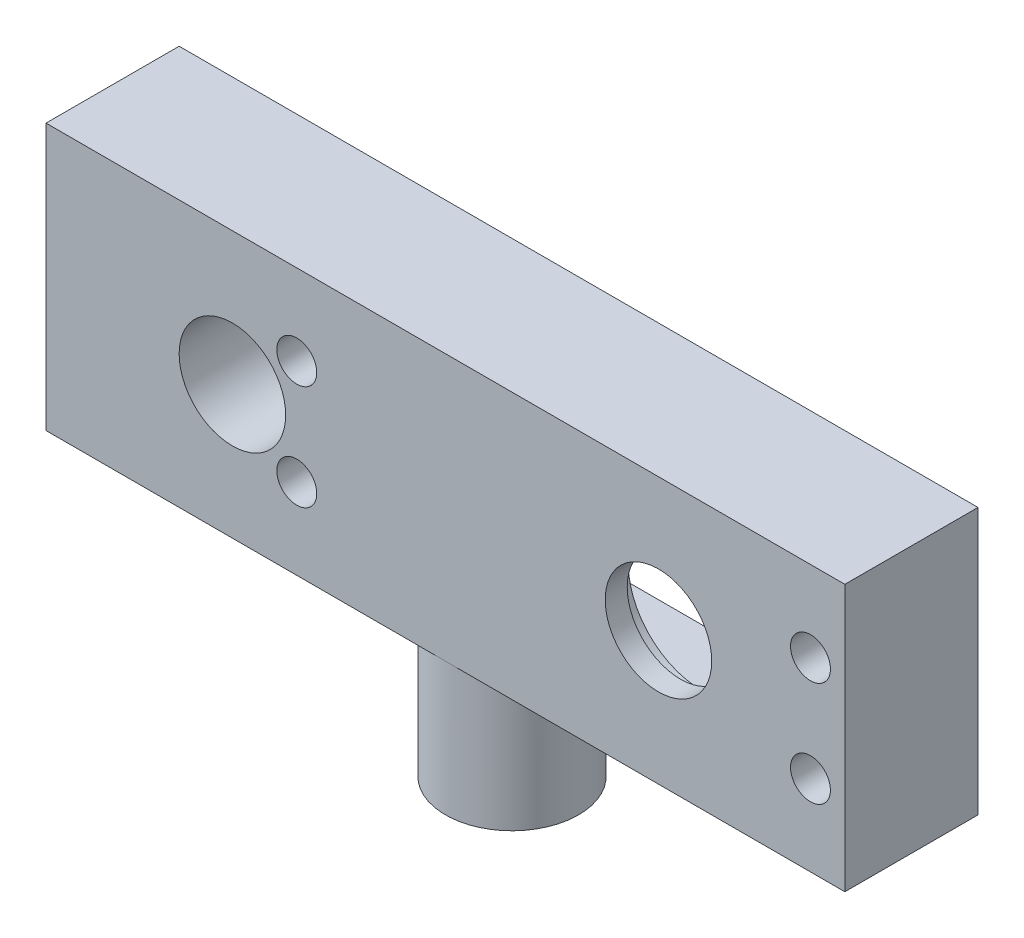
ISO-10303-21;
HEADER;
FILE_DESCRIPTION(('STEP AP214'),'2;1');
FILE_NAME('part.step','',(''),(''),'','','');
FILE_SCHEMA(('AUTOMOTIVE_DESIGN { 1 0 10303 214 1 1 1 1 }'));
ENDSEC;
DATA;
#1=APPLICATION_CONTEXT('core data for automotive mechanical design processes');
#2=APPLICATION_PROTOCOL_DEFINITION('international standard','automotive_design',2000,#1);
#3=PRODUCT_CONTEXT('',#1,'mechanical');
#4=PRODUCT('Part','Part','',(#3));
#5=PRODUCT_RELATED_PRODUCT_CATEGORY('part','',(#4));
#6=PRODUCT_DEFINITION_FORMATION('','',#4);
#7=PRODUCT_DEFINITION_CONTEXT('part definition',#1,'design');
#8=PRODUCT_DEFINITION('design','',#6,#7);
#9=PRODUCT_DEFINITION_SHAPE('','',#8);
#10=(LENGTH_UNIT() NAMED_UNIT(*) SI_UNIT(.MILLI.,.METRE.));
#11=(NAMED_UNIT(*) PLANE_ANGLE_UNIT() SI_UNIT($,.RADIAN.));
#12=(NAMED_UNIT(*) SI_UNIT($,.STERADIAN.) SOLID_ANGLE_UNIT());
#13=UNCERTAINTY_MEASURE_WITH_UNIT(LENGTH_MEASURE(1.E-05),#10,'distance_accuracy_value','');
#14=(GEOMETRIC_REPRESENTATION_CONTEXT(3) GLOBAL_UNCERTAINTY_ASSIGNED_CONTEXT((#13)) GLOBAL_UNIT_ASSIGNED_CONTEXT((#10,
#11,#12)) REPRESENTATION_CONTEXT('',''));
#15=CARTESIAN_POINT('',(0.,0.,0.));
#16=DIRECTION('',(0.,0.,1.));
#17=DIRECTION('',(1.,0.,0.));
#18=AXIS2_PLACEMENT_3D('',#15,#16,#17);
#19=CARTESIAN_POINT('',(-38.1,-12.7,12.7));
#20=DIRECTION('',(0.,1.,0.));
#21=DIRECTION('',(0.,0.,1.));
#22=AXIS2_PLACEMENT_3D('',#19,#20,#21);
#23=PLANE('',#22);
#24=CARTESIAN_POINT('',(0.,-12.7,6.35));
#25=DIRECTION('',(0.,-1.,0.));
#26=DIRECTION('',(0.,0.,-1.));
#27=AXIS2_PLACEMENT_3D('',#24,#25,#26);
#28=CIRCLE('',#27,6.35);
#29=CARTESIAN_POINT('',(0.,-12.7,0.));
#30=VERTEX_POINT('',#29);
#31=CARTESIAN_POINT('',(0.,-12.7,12.7));
#32=VERTEX_POINT('',#31);
#33=EDGE_CURVE('E50',#30,#32,#28,.T.);
#34=ORIENTED_EDGE('',*,*,#33,.F.);
#35=DIRECTION('',(1.,0.,0.));
#36=VECTOR('',#35,1.);
#37=CARTESIAN_POINT('',(-38.1,-12.7,0.));
#38=LINE('',#37,#36);
#39=CARTESIAN_POINT('',(38.1,-12.7,0.));
#40=VERTEX_POINT('',#39);
#41=EDGE_CURVE('E168',#30,#40,#38,.T.);
#42=ORIENTED_EDGE('',*,*,#41,.T.);
#43=DIRECTION('',(0.,0.,-1.));
#44=VECTOR('',#43,1.);
#45=CARTESIAN_POINT('',(38.1,-12.7,12.7));
#46=LINE('',#45,#44);
#47=CARTESIAN_POINT('',(38.1,-12.7,12.7));
#48=VERTEX_POINT('',#47);
#49=EDGE_CURVE('E240',#48,#40,#46,.T.);
#50=ORIENTED_EDGE('',*,*,#49,.F.);
#51=DIRECTION('',(1.,0.,0.));
#52=VECTOR('',#51,1.);
#53=CARTESIAN_POINT('',(-38.1,-12.7,12.7));
#54=LINE('',#53,#52);
#55=EDGE_CURVE('E180',#32,#48,#54,.T.);
#56=ORIENTED_EDGE('',*,*,#55,.F.);
#57=EDGE_LOOP('',(#34,#42,#50,#56));
#58=FACE_BOUND('',#57,.T.);
#59=ADVANCED_FACE('F39',(#58),#23,.F.);
#60=CARTESIAN_POINT('',(20.32,0.,0.));
#61=DIRECTION('',(0.,0.,1.));
#62=DIRECTION('',(1.,0.,0.));
#63=AXIS2_PLACEMENT_3D('',#60,#61,#62);
#64=CYLINDRICAL_SURFACE('',#63,5.08);
#65=CARTESIAN_POINT('',(20.32,0.,12.7));
#66=DIRECTION('',(0.,0.,1.));
#67=DIRECTION('',(1.,0.,0.));
#68=AXIS2_PLACEMENT_3D('',#65,#66,#67);
#69=CIRCLE('',#68,5.08);
#70=CARTESIAN_POINT('',(25.4,0.,12.7));
#71=VERTEX_POINT('',#70);
#72=EDGE_CURVE('E276',#71,#71,#69,.T.);
#73=ORIENTED_EDGE('',*,*,#72,.T.);
#74=EDGE_LOOP('',(#73));
#75=FACE_BOUND('',#74,.T.);
#76=CARTESIAN_POINT('',(20.32,0.,10.599928));
#77=DIRECTION('',(0.,0.,-1.));
#78=DIRECTION('',(-1.,0.,0.));
#79=AXIS2_PLACEMENT_3D('',#76,#77,#78);
#80=CIRCLE('',#79,5.08);
#81=CARTESIAN_POINT('',(15.24,0.,10.599928));
#82=VERTEX_POINT('',#81);
#83=EDGE_CURVE('E43',#82,#82,#80,.F.);
#84=ORIENTED_EDGE('',*,*,#83,.F.);
#85=EDGE_LOOP('',(#84));
#86=FACE_BOUND('',#85,.T.);
#87=ADVANCED_FACE('F205',(#75,#86),#64,.F.);
#88=CARTESIAN_POINT('',(-20.32,0.,0.));
#89=DIRECTION('',(0.,0.,1.));
#90=DIRECTION('',(1.,0.,0.));
#91=AXIS2_PLACEMENT_3D('',#88,#89,#90);
#92=CYLINDRICAL_SURFACE('',#91,5.08);
#93=CARTESIAN_POINT('',(-20.32,0.,12.7));
#94=DIRECTION('',(0.,0.,1.));
#95=DIRECTION('',(-1.,0.,0.));
#96=AXIS2_PLACEMENT_3D('',#93,#94,#95);
#97=CIRCLE('',#96,5.08);
#98=CARTESIAN_POINT('',(-25.4,0.,12.7));
#99=VERTEX_POINT('',#98);
#100=EDGE_CURVE('E272',#99,#99,#97,.T.);
#101=ORIENTED_EDGE('',*,*,#100,.T.);
#102=EDGE_LOOP('',(#101));
#103=FACE_BOUND('',#102,.T.);
#104=DIRECTION('',(0.,0.,1.));
#105=VECTOR('',#104,1.);
#106=CARTESIAN_POINT('',(-15.4013111503166,1.27000000000001,0.));
#107=LINE('',#106,#105);
#108=CARTESIAN_POINT('',(-15.4013111503166,1.27000000000001,8.599932));
#109=VERTEX_POINT('',#108);
#110=CARTESIAN_POINT('',(-15.4013111503166,1.27000000000001,0.));
#111=VERTEX_POINT('',#110);
#112=EDGE_CURVE('E48',#109,#111,#107,.F.);
#113=ORIENTED_EDGE('',*,*,#112,.F.);
#114=CARTESIAN_POINT('',(-20.32,0.,8.599932));
#115=DIRECTION('',(0.,0.,-1.));
#116=DIRECTION('',(-1.,0.,0.));
#117=AXIS2_PLACEMENT_3D('',#114,#115,#116);
#118=CIRCLE('',#117,5.08);
#119=CARTESIAN_POINT('',(-15.4013111503166,-1.26999999999999,8.599932));
#120=VERTEX_POINT('',#119);
#121=EDGE_CURVE('E312',#120,#109,#118,.F.);
#122=ORIENTED_EDGE('',*,*,#121,.F.);
#123=DIRECTION('',(0.,0.,1.));
#124=VECTOR('',#123,1.);
#125=CARTESIAN_POINT('',(-15.4013111503166,-1.26999999999999,0.));
#126=LINE('',#125,#124);
#127=CARTESIAN_POINT('',(-15.4013111503166,-1.26999999999999,0.));
#128=VERTEX_POINT('',#127);
#129=EDGE_CURVE('E248',#120,#128,#126,.F.);
#130=ORIENTED_EDGE('',*,*,#129,.T.);
#131=CARTESIAN_POINT('',(-20.32,0.,0.));
#132=DIRECTION('',(0.,0.,1.));
#133=DIRECTION('',(-1.,0.,0.));
#134=AXIS2_PLACEMENT_3D('',#131,#132,#133);
#135=CIRCLE('',#134,5.08);
#136=EDGE_CURVE('E267',#111,#128,#135,.T.);
#137=ORIENTED_EDGE('',*,*,#136,.F.);
#138=EDGE_LOOP('',(#113,#122,#130,#137));
#139=FACE_BOUND('',#138,.T.);
#140=ADVANCED_FACE('F211',(#103,#139),#92,.F.);
#141=CARTESIAN_POINT('',(38.1,-12.7,12.7));
#142=DIRECTION('',(-1.,0.,0.));
#143=DIRECTION('',(0.,0.,1.));
#144=AXIS2_PLACEMENT_3D('',#141,#142,#143);
#145=PLANE('',#144);
#146=DIRECTION('',(0.,1.,0.));
#147=VECTOR('',#146,1.);
#148=CARTESIAN_POINT('',(38.1,-12.7,0.));
#149=LINE('',#148,#147);
#150=CARTESIAN_POINT('',(38.1,12.7,0.));
#151=VERTEX_POINT('',#150);
#152=EDGE_CURVE('E174',#40,#151,#149,.T.);
#153=ORIENTED_EDGE('',*,*,#152,.T.);
#154=DIRECTION('',(0.,0.,-1.));
#155=VECTOR('',#154,1.);
#156=CARTESIAN_POINT('',(38.1,12.7,12.7));
#157=LINE('',#156,#155);
#158=CARTESIAN_POINT('',(38.1,12.7,12.7));
#159=VERTEX_POINT('',#158);
#160=EDGE_CURVE('E245',#159,#151,#157,.T.);
#161=ORIENTED_EDGE('',*,*,#160,.F.);
#162=DIRECTION('',(0.,1.,0.));
#163=VECTOR('',#162,1.);
#164=CARTESIAN_POINT('',(38.1,-12.7,12.7));
#165=LINE('',#164,#163);
#166=EDGE_CURVE('E167',#48,#159,#165,.T.);
#167=ORIENTED_EDGE('',*,*,#166,.F.);
#168=ORIENTED_EDGE('',*,*,#49,.T.);
#169=EDGE_LOOP('',(#153,#161,#167,#168));
#170=FACE_BOUND('',#169,.T.);
#171=ADVANCED_FACE('F41',(#170),#145,.F.);
#172=CARTESIAN_POINT('',(-38.1,12.7,12.7));
#173=DIRECTION('',(0.,-1.,0.));
#174=DIRECTION('',(0.,0.,-1.));
#175=AXIS2_PLACEMENT_3D('',#172,#173,#174);
#176=PLANE('',#175);
#177=DIRECTION('',(-1.,0.,0.));
#178=VECTOR('',#177,1.);
#179=CARTESIAN_POINT('',(-38.1,12.7,0.));
#180=LINE('',#179,#178);
#181=CARTESIAN_POINT('',(-38.1,12.7,0.));
#182=VERTEX_POINT('',#181);
#183=EDGE_CURVE('E235',#151,#182,#180,.T.);
#184=ORIENTED_EDGE('',*,*,#183,.T.);
#185=DIRECTION('',(0.,0.,-1.));
#186=VECTOR('',#185,1.);
#187=CARTESIAN_POINT('',(-38.1,12.7,12.7));
#188=LINE('',#187,#186);
#189=CARTESIAN_POINT('',(-38.1,12.7,12.7));
#190=VERTEX_POINT('',#189);
#191=EDGE_CURVE('E234',#190,#182,#188,.T.);
#192=ORIENTED_EDGE('',*,*,#191,.F.);
#193=DIRECTION('',(-1.,0.,0.));
#194=VECTOR('',#193,1.);
#195=CARTESIAN_POINT('',(-38.1,12.7,12.7));
#196=LINE('',#195,#194);
#197=EDGE_CURVE('E285',#159,#190,#196,.T.);
#198=ORIENTED_EDGE('',*,*,#197,.F.);
#199=ORIENTED_EDGE('',*,*,#160,.T.);
#200=EDGE_LOOP('',(#184,#192,#198,#199));
#201=FACE_BOUND('',#200,.T.);
#202=ADVANCED_FACE('F224',(#201),#176,.F.);
#203=CARTESIAN_POINT('',(-38.1,-12.7,12.7));
#204=DIRECTION('',(1.,0.,0.));
#205=DIRECTION('',(0.,0.,-1.));
#206=AXIS2_PLACEMENT_3D('',#203,#204,#205);
#207=PLANE('',#206);
#208=DIRECTION('',(0.,-1.,0.));
#209=VECTOR('',#208,1.);
#210=CARTESIAN_POINT('',(-38.1,-12.7,0.));
#211=LINE('',#210,#209);
#212=CARTESIAN_POINT('',(-38.1,-12.7,0.));
#213=VERTEX_POINT('',#212);
#214=EDGE_CURVE('E178',#182,#213,#211,.T.);
#215=ORIENTED_EDGE('',*,*,#214,.T.);
#216=DIRECTION('',(0.,0.,-1.));
#217=VECTOR('',#216,1.);
#218=CARTESIAN_POINT('',(-38.1,-12.7,12.7));
#219=LINE('',#218,#217);
#220=CARTESIAN_POINT('',(-38.1,-12.7,12.7));
#221=VERTEX_POINT('',#220);
#222=EDGE_CURVE('E164',#221,#213,#219,.T.);
#223=ORIENTED_EDGE('',*,*,#222,.F.);
#224=DIRECTION('',(0.,-1.,0.));
#225=VECTOR('',#224,1.);
#226=CARTESIAN_POINT('',(-38.1,-12.7,12.7));
#227=LINE('',#226,#225);
#228=EDGE_CURVE('E287',#190,#221,#227,.T.);
#229=ORIENTED_EDGE('',*,*,#228,.F.);
#230=ORIENTED_EDGE('',*,*,#191,.T.);
#231=EDGE_LOOP('',(#215,#223,#229,#230));
#232=FACE_BOUND('',#231,.T.);
#233=ADVANCED_FACE('F217',(#232),#207,.F.);
#234=EDGE_CURVE('E11',#32,#30,#28,.T.);
#235=ORIENTED_EDGE('',*,*,#234,.F.);
#236=EDGE_CURVE('E242',#221,#32,#54,.T.);
#237=ORIENTED_EDGE('',*,*,#236,.F.);
#238=ORIENTED_EDGE('',*,*,#222,.T.);
#239=EDGE_CURVE('E160',#213,#30,#38,.T.);
#240=ORIENTED_EDGE('',*,*,#239,.T.);
#241=EDGE_LOOP('',(#235,#237,#238,#240));
#242=FACE_BOUND('',#241,.T.);
#243=ADVANCED_FACE('F162',(#242),#23,.F.);
#244=CARTESIAN_POINT('',(0.,0.,12.7));
#245=DIRECTION('',(0.,0.,-1.));
#246=DIRECTION('',(-1.,0.,0.));
#247=AXIS2_PLACEMENT_3D('',#244,#245,#246);
#248=PLANE('',#247);
#249=CARTESIAN_POINT('',(-14.179804,4.99999,12.7));
#250=DIRECTION('',(0.,0.,1.));
#251=DIRECTION('',(1.,0.,0.));
#252=AXIS2_PLACEMENT_3D('',#249,#250,#251);
#253=CIRCLE('',#252,1.905);
#254=CARTESIAN_POINT('',(-12.274804,4.99999,12.7));
#255=VERTEX_POINT('',#254);
#256=EDGE_CURVE('E295',#255,#255,#253,.T.);
#257=ORIENTED_EDGE('',*,*,#256,.F.);
#258=EDGE_LOOP('',(#257));
#259=FACE_BOUND('',#258,.T.);
#260=CARTESIAN_POINT('',(34.820098,-4.99999,12.7));
#261=DIRECTION('',(0.,0.,1.));
#262=DIRECTION('',(-1.,0.,0.));
#263=AXIS2_PLACEMENT_3D('',#260,#261,#262);
#264=CIRCLE('',#263,1.905);
#265=CARTESIAN_POINT('',(32.915098,-4.99999,12.7));
#266=VERTEX_POINT('',#265);
#267=EDGE_CURVE('E300',#266,#266,#264,.T.);
#268=ORIENTED_EDGE('',*,*,#267,.F.);
#269=EDGE_LOOP('',(#268));
#270=FACE_BOUND('',#269,.T.);
#271=CARTESIAN_POINT('',(-14.179804,-4.99999,12.7));
#272=DIRECTION('',(0.,0.,1.));
#273=DIRECTION('',(-1.,0.,0.));
#274=AXIS2_PLACEMENT_3D('',#271,#272,#273);
#275=CIRCLE('',#274,1.905);
#276=CARTESIAN_POINT('',(-16.084804,-4.99999,12.7));
#277=VERTEX_POINT('',#276);
#278=EDGE_CURVE('E301',#277,#277,#275,.T.);
#279=ORIENTED_EDGE('',*,*,#278,.F.);
#280=EDGE_LOOP('',(#279));
#281=FACE_BOUND('',#280,.T.);
#282=CARTESIAN_POINT('',(34.820098,4.99999,12.7));
#283=DIRECTION('',(0.,0.,1.));
#284=DIRECTION('',(1.,0.,0.));
#285=AXIS2_PLACEMENT_3D('',#282,#283,#284);
#286=CIRCLE('',#285,1.905);
#287=CARTESIAN_POINT('',(36.725098,4.99999,12.7));
#288=VERTEX_POINT('',#287);
#289=EDGE_CURVE('E279',#288,#288,#286,.T.);
#290=ORIENTED_EDGE('',*,*,#289,.F.);
#291=EDGE_LOOP('',(#290));
#292=FACE_BOUND('',#291,.T.);
#293=ORIENTED_EDGE('',*,*,#72,.F.);
#294=EDGE_LOOP('',(#293));
#295=FACE_BOUND('',#294,.T.);
#296=ORIENTED_EDGE('',*,*,#100,.F.);
#297=EDGE_LOOP('',(#296));
#298=FACE_BOUND('',#297,.T.);
#299=ORIENTED_EDGE('',*,*,#166,.T.);
#300=ORIENTED_EDGE('',*,*,#197,.T.);
#301=ORIENTED_EDGE('',*,*,#228,.T.);
#302=ORIENTED_EDGE('',*,*,#236,.T.);
#303=ORIENTED_EDGE('',*,*,#55,.T.);
#304=EDGE_LOOP('',(#299,#300,#301,#302,#303));
#305=FACE_BOUND('',#304,.T.);
#306=ADVANCED_FACE('F216',(#259,#270,#281,#292,#295,#298,#305),#248,.F.);
#307=CARTESIAN_POINT('',(0.,0.,0.));
#308=DIRECTION('',(0.,0.,-1.));
#309=DIRECTION('',(-1.,0.,0.));
#310=AXIS2_PLACEMENT_3D('',#307,#308,#309);
#311=PLANE('',#310);
#312=DIRECTION('',(-1.,0.,0.));
#313=VECTOR('',#312,1.);
#314=CARTESIAN_POINT('',(-9.999853,-1.26999999999999,0.));
#315=LINE('',#314,#313);
#316=CARTESIAN_POINT('',(-9.999853,-1.26999999999999,0.));
#317=VERTEX_POINT('',#316);
#318=EDGE_CURVE('E270',#317,#128,#315,.T.);
#319=ORIENTED_EDGE('',*,*,#318,.F.);
#320=DIRECTION('',(0.,1.,0.));
#321=VECTOR('',#320,1.);
#322=CARTESIAN_POINT('',(-9.99985299999999,-10.16,0.));
#323=LINE('',#322,#321);
#324=CARTESIAN_POINT('',(-9.99985299999999,-10.16,0.));
#325=VERTEX_POINT('',#324);
#326=EDGE_CURVE('E361',#325,#317,#323,.T.);
#327=ORIENTED_EDGE('',*,*,#326,.F.);
#328=DIRECTION('',(-1.,0.,0.));
#329=VECTOR('',#328,1.);
#330=CARTESIAN_POINT('',(30.640147,-10.16,0.));
#331=LINE('',#330,#329);
#332=CARTESIAN_POINT('',(30.640147,-10.16,0.));
#333=VERTEX_POINT('',#332);
#334=EDGE_CURVE('E358',#333,#325,#331,.T.);
#335=ORIENTED_EDGE('',*,*,#334,.F.);
#336=DIRECTION('',(0.,1.,0.));
#337=VECTOR('',#336,1.);
#338=CARTESIAN_POINT('',(30.640147,-10.16,0.));
#339=LINE('',#338,#337);
#340=CARTESIAN_POINT('',(30.640147,-1.27,0.));
#341=VERTEX_POINT('',#340);
#342=EDGE_CURVE('E353',#333,#341,#339,.T.);
#343=ORIENTED_EDGE('',*,*,#342,.T.);
#344=DIRECTION('',(1.,0.,0.));
#345=VECTOR('',#344,1.);
#346=CARTESIAN_POINT('',(30.640147,-1.27,0.));
#347=LINE('',#346,#345);
#348=CARTESIAN_POINT('',(36.344098,-1.27,0.));
#349=VERTEX_POINT('',#348);
#350=EDGE_CURVE('E335',#341,#349,#347,.T.);
#351=ORIENTED_EDGE('',*,*,#350,.T.);
#352=DIRECTION('',(0.,-1.,0.));
#353=VECTOR('',#352,1.);
#354=CARTESIAN_POINT('',(36.344098,1.27,0.));
#355=LINE('',#354,#353);
#356=CARTESIAN_POINT('',(36.344098,1.27,0.));
#357=VERTEX_POINT('',#356);
#358=EDGE_CURVE('E332',#357,#349,#355,.T.);
#359=ORIENTED_EDGE('',*,*,#358,.F.);
#360=DIRECTION('',(1.,0.,0.));
#361=VECTOR('',#360,1.);
#362=CARTESIAN_POINT('',(30.640147,1.27,0.));
#363=LINE('',#362,#361);
#364=CARTESIAN_POINT('',(30.640147,1.27,0.));
#365=VERTEX_POINT('',#364);
#366=EDGE_CURVE('E328',#365,#357,#363,.T.);
#367=ORIENTED_EDGE('',*,*,#366,.F.);
#368=CARTESIAN_POINT('',(30.640147,10.16,0.));
#369=VERTEX_POINT('',#368);
#370=EDGE_CURVE('E357',#365,#369,#339,.T.);
#371=ORIENTED_EDGE('',*,*,#370,.T.);
#372=DIRECTION('',(-1.,0.,0.));
#373=VECTOR('',#372,1.);
#374=CARTESIAN_POINT('',(30.640147,10.16,0.));
#375=LINE('',#374,#373);
#376=CARTESIAN_POINT('',(-9.99985299999999,10.16,0.));
#377=VERTEX_POINT('',#376);
#378=EDGE_CURVE('E319',#369,#377,#375,.T.);
#379=ORIENTED_EDGE('',*,*,#378,.T.);
#380=CARTESIAN_POINT('',(-9.999853,1.27000000000001,0.));
#381=VERTEX_POINT('',#380);
#382=EDGE_CURVE('E269',#381,#377,#323,.T.);
#383=ORIENTED_EDGE('',*,*,#382,.F.);
#384=DIRECTION('',(-1.,0.,0.));
#385=VECTOR('',#384,1.);
#386=CARTESIAN_POINT('',(-9.999853,1.27000000000001,0.));
#387=LINE('',#386,#385);
#388=EDGE_CURVE('E256',#381,#111,#387,.T.);
#389=ORIENTED_EDGE('',*,*,#388,.T.);
#390=ORIENTED_EDGE('',*,*,#136,.T.);
#391=EDGE_LOOP('',(#319,#327,#335,#343,#351,#359,#367,#371,#379,#383,#389,#390));
#392=FACE_BOUND('',#391,.T.);
#393=CARTESIAN_POINT('',(-14.179804,4.99999,0.));
#394=DIRECTION('',(0.,0.,1.));
#395=DIRECTION('',(1.,0.,0.));
#396=AXIS2_PLACEMENT_3D('',#393,#394,#395);
#397=CIRCLE('',#396,1.905);
#398=CARTESIAN_POINT('',(-12.274804,4.99999,0.));
#399=VERTEX_POINT('',#398);
#400=EDGE_CURVE('E304',#399,#399,#397,.T.);
#401=ORIENTED_EDGE('',*,*,#400,.T.);
#402=EDGE_LOOP('',(#401));
#403=FACE_BOUND('',#402,.T.);
#404=CARTESIAN_POINT('',(34.820098,-4.99999,0.));
#405=DIRECTION('',(0.,0.,1.));
#406=DIRECTION('',(-1.,0.,0.));
#407=AXIS2_PLACEMENT_3D('',#404,#405,#406);
#408=CIRCLE('',#407,1.905);
#409=CARTESIAN_POINT('',(32.915098,-4.99999,0.));
#410=VERTEX_POINT('',#409);
#411=EDGE_CURVE('E297',#410,#410,#408,.T.);
#412=ORIENTED_EDGE('',*,*,#411,.T.);
#413=EDGE_LOOP('',(#412));
#414=FACE_BOUND('',#413,.T.);
#415=CARTESIAN_POINT('',(-14.179804,-4.99999,0.));
#416=DIRECTION('',(0.,0.,1.));
#417=DIRECTION('',(-1.,0.,0.));
#418=AXIS2_PLACEMENT_3D('',#415,#416,#417);
#419=CIRCLE('',#418,1.905);
#420=CARTESIAN_POINT('',(-16.084804,-4.99999,0.));
#421=VERTEX_POINT('',#420);
#422=EDGE_CURVE('E309',#421,#421,#419,.T.);
#423=ORIENTED_EDGE('',*,*,#422,.T.);
#424=EDGE_LOOP('',(#423));
#425=FACE_BOUND('',#424,.T.);
#426=CARTESIAN_POINT('',(34.820098,4.99999,0.));
#427=DIRECTION('',(0.,0.,1.));
#428=DIRECTION('',(1.,0.,0.));
#429=AXIS2_PLACEMENT_3D('',#426,#427,#428);
#430=CIRCLE('',#429,1.905);
#431=CARTESIAN_POINT('',(36.725098,4.99999,0.));
#432=VERTEX_POINT('',#431);
#433=EDGE_CURVE('E273',#432,#432,#430,.T.);
#434=ORIENTED_EDGE('',*,*,#433,.T.);
#435=EDGE_LOOP('',(#434));
#436=FACE_BOUND('',#435,.T.);
#437=ORIENTED_EDGE('',*,*,#152,.F.);
#438=ORIENTED_EDGE('',*,*,#41,.F.);
#439=ORIENTED_EDGE('',*,*,#239,.F.);
#440=ORIENTED_EDGE('',*,*,#214,.F.);
#441=ORIENTED_EDGE('',*,*,#183,.F.);
#442=EDGE_LOOP('',(#437,#438,#439,#440,#441));
#443=FACE_BOUND('',#442,.T.);
#444=ADVANCED_FACE('F172',(#392,#403,#414,#425,#436,#443),#311,.T.);
#445=CARTESIAN_POINT('',(34.820098,4.99999,0.));
#446=DIRECTION('',(0.,0.,1.));
#447=DIRECTION('',(1.,0.,0.));
#448=AXIS2_PLACEMENT_3D('',#445,#446,#447);
#449=CYLINDRICAL_SURFACE('',#448,1.905);
#450=ORIENTED_EDGE('',*,*,#433,.F.);
#451=EDGE_LOOP('',(#450));
#452=FACE_BOUND('',#451,.T.);
#453=ORIENTED_EDGE('',*,*,#289,.T.);
#454=EDGE_LOOP('',(#453));
#455=FACE_BOUND('',#454,.T.);
#456=ADVANCED_FACE('F585',(#452,#455),#449,.F.);
#457=CARTESIAN_POINT('',(-14.179804,-4.99999,0.));
#458=DIRECTION('',(0.,0.,1.));
#459=DIRECTION('',(1.,0.,0.));
#460=AXIS2_PLACEMENT_3D('',#457,#458,#459);
#461=CYLINDRICAL_SURFACE('',#460,1.905);
#462=ORIENTED_EDGE('',*,*,#422,.F.);
#463=EDGE_LOOP('',(#462));
#464=FACE_BOUND('',#463,.T.);
#465=ORIENTED_EDGE('',*,*,#278,.T.);
#466=EDGE_LOOP('',(#465));
#467=FACE_BOUND('',#466,.T.);
#468=ADVANCED_FACE('F576',(#464,#467),#461,.F.);
#469=CARTESIAN_POINT('',(34.820098,-4.99999,0.));
#470=DIRECTION('',(0.,0.,1.));
#471=DIRECTION('',(1.,0.,0.));
#472=AXIS2_PLACEMENT_3D('',#469,#470,#471);
#473=CYLINDRICAL_SURFACE('',#472,1.905);
#474=ORIENTED_EDGE('',*,*,#411,.F.);
#475=EDGE_LOOP('',(#474));
#476=FACE_BOUND('',#475,.T.);
#477=ORIENTED_EDGE('',*,*,#267,.T.);
#478=EDGE_LOOP('',(#477));
#479=FACE_BOUND('',#478,.T.);
#480=ADVANCED_FACE('F567',(#476,#479),#473,.F.);
#481=CARTESIAN_POINT('',(-14.179804,4.99999,0.));
#482=DIRECTION('',(0.,0.,1.));
#483=DIRECTION('',(1.,0.,0.));
#484=AXIS2_PLACEMENT_3D('',#481,#482,#483);
#485=CYLINDRICAL_SURFACE('',#484,1.905);
#486=ORIENTED_EDGE('',*,*,#400,.F.);
#487=EDGE_LOOP('',(#486));
#488=FACE_BOUND('',#487,.T.);
#489=ORIENTED_EDGE('',*,*,#256,.T.);
#490=EDGE_LOOP('',(#489));
#491=FACE_BOUND('',#490,.T.);
#492=ADVANCED_FACE('F550',(#488,#491),#485,.F.);
#493=CARTESIAN_POINT('',(-9.999853,1.27000000000001,8.599932));
#494=DIRECTION('',(0.,-1.,0.));
#495=DIRECTION('',(1.,0.,0.));
#496=AXIS2_PLACEMENT_3D('',#493,#494,#495);
#497=PLANE('',#496);
#498=ORIENTED_EDGE('',*,*,#112,.T.);
#499=ORIENTED_EDGE('',*,*,#388,.F.);
#500=DIRECTION('',(0.,0.,-1.));
#501=VECTOR('',#500,1.);
#502=CARTESIAN_POINT('',(-9.999853,1.27000000000001,8.599932));
#503=LINE('',#502,#501);
#504=CARTESIAN_POINT('',(-9.999853,1.27000000000001,8.599932));
#505=VERTEX_POINT('',#504);
#506=EDGE_CURVE('E316',#505,#381,#503,.T.);
#507=ORIENTED_EDGE('',*,*,#506,.F.);
#508=DIRECTION('',(-1.,0.,0.));
#509=VECTOR('',#508,1.);
#510=CARTESIAN_POINT('',(-9.999853,1.27000000000001,8.599932));
#511=LINE('',#510,#509);
#512=EDGE_CURVE('E259',#505,#109,#511,.T.);
#513=ORIENTED_EDGE('',*,*,#512,.T.);
#514=EDGE_LOOP('',(#498,#499,#507,#513));
#515=FACE_BOUND('',#514,.T.);
#516=ADVANCED_FACE('F255',(#515),#497,.T.);
#517=CARTESIAN_POINT('',(-9.999853,-1.26999999999999,8.599932));
#518=DIRECTION('',(0.,-1.,0.));
#519=DIRECTION('',(1.,0.,0.));
#520=AXIS2_PLACEMENT_3D('',#517,#518,#519);
#521=PLANE('',#520);
#522=DIRECTION('',(-1.,0.,0.));
#523=VECTOR('',#522,1.);
#524=CARTESIAN_POINT('',(-9.999853,-1.26999999999999,8.599932));
#525=LINE('',#524,#523);
#526=CARTESIAN_POINT('',(-9.999853,-1.26999999999999,8.599932));
#527=VERTEX_POINT('',#526);
#528=EDGE_CURVE('E63',#527,#120,#525,.T.);
#529=ORIENTED_EDGE('',*,*,#528,.F.);
#530=DIRECTION('',(0.,0.,-1.));
#531=VECTOR('',#530,1.);
#532=CARTESIAN_POINT('',(-9.999853,-1.26999999999999,8.599932));
#533=LINE('',#532,#531);
#534=EDGE_CURVE('E376',#527,#317,#533,.T.);
#535=ORIENTED_EDGE('',*,*,#534,.T.);
#536=ORIENTED_EDGE('',*,*,#318,.T.);
#537=ORIENTED_EDGE('',*,*,#129,.F.);
#538=EDGE_LOOP('',(#529,#535,#536,#537));
#539=FACE_BOUND('',#538,.T.);
#540=ADVANCED_FACE('F533',(#539),#521,.F.);
#541=CARTESIAN_POINT('',(0.,0.,8.599932));
#542=DIRECTION('',(0.,0.,-1.));
#543=DIRECTION('',(-1.,0.,0.));
#544=AXIS2_PLACEMENT_3D('',#541,#542,#543);
#545=PLANE('',#544);
#546=CARTESIAN_POINT('',(20.32,0.,8.599932));
#547=DIRECTION('',(0.,0.,-1.));
#548=DIRECTION('',(-1.,0.,0.));
#549=AXIS2_PLACEMENT_3D('',#546,#547,#548);
#550=CIRCLE('',#549,6.985);
#551=CARTESIAN_POINT('',(13.335,0.,8.599932));
#552=VERTEX_POINT('',#551);
#553=EDGE_CURVE('E382',#552,#552,#550,.T.);
#554=ORIENTED_EDGE('',*,*,#553,.F.);
#555=EDGE_LOOP('',(#554));
#556=FACE_BOUND('',#555,.T.);
#557=ORIENTED_EDGE('',*,*,#121,.T.);
#558=ORIENTED_EDGE('',*,*,#512,.F.);
#559=DIRECTION('',(0.,1.,0.));
#560=VECTOR('',#559,1.);
#561=CARTESIAN_POINT('',(-9.99985299999999,-10.16,8.599932));
#562=LINE('',#561,#560);
#563=CARTESIAN_POINT('',(-9.99985299999999,10.16,8.599932));
#564=VERTEX_POINT('',#563);
#565=EDGE_CURVE('E373',#505,#564,#562,.T.);
#566=ORIENTED_EDGE('',*,*,#565,.T.);
#567=DIRECTION('',(-1.,0.,0.));
#568=VECTOR('',#567,1.);
#569=CARTESIAN_POINT('',(30.640147,10.16,8.599932));
#570=LINE('',#569,#568);
#571=CARTESIAN_POINT('',(30.640147,10.16,8.599932));
#572=VERTEX_POINT('',#571);
#573=EDGE_CURVE('E356',#572,#564,#570,.T.);
#574=ORIENTED_EDGE('',*,*,#573,.F.);
#575=DIRECTION('',(0.,1.,0.));
#576=VECTOR('',#575,1.);
#577=CARTESIAN_POINT('',(30.640147,-10.16,8.599932));
#578=LINE('',#577,#576);
#579=CARTESIAN_POINT('',(30.640147,1.27,8.599932));
#580=VERTEX_POINT('',#579);
#581=EDGE_CURVE('E367',#580,#572,#578,.T.);
#582=ORIENTED_EDGE('',*,*,#581,.F.);
#583=DIRECTION('',(1.,0.,0.));
#584=VECTOR('',#583,1.);
#585=CARTESIAN_POINT('',(30.640147,1.27,8.599932));
#586=LINE('',#585,#584);
#587=CARTESIAN_POINT('',(36.344098,1.27,8.599932));
#588=VERTEX_POINT('',#587);
#589=EDGE_CURVE('E322',#580,#588,#586,.T.);
#590=ORIENTED_EDGE('',*,*,#589,.T.);
#591=DIRECTION('',(0.,-1.,0.));
#592=VECTOR('',#591,1.);
#593=CARTESIAN_POINT('',(36.344098,1.27,8.599932));
#594=LINE('',#593,#592);
#595=CARTESIAN_POINT('',(36.344098,-1.27,8.599932));
#596=VERTEX_POINT('',#595);
#597=EDGE_CURVE('E340',#588,#596,#594,.T.);
#598=ORIENTED_EDGE('',*,*,#597,.T.);
#599=DIRECTION('',(1.,0.,0.));
#600=VECTOR('',#599,1.);
#601=CARTESIAN_POINT('',(30.640147,-1.27,8.599932));
#602=LINE('',#601,#600);
#603=CARTESIAN_POINT('',(30.640147,-1.27,8.599932));
#604=VERTEX_POINT('',#603);
#605=EDGE_CURVE('E331',#604,#596,#602,.T.);
#606=ORIENTED_EDGE('',*,*,#605,.F.);
#607=CARTESIAN_POINT('',(30.640147,-10.16,8.599932));
#608=VERTEX_POINT('',#607);
#609=EDGE_CURVE('E352',#608,#604,#578,.T.);
#610=ORIENTED_EDGE('',*,*,#609,.F.);
#611=DIRECTION('',(-1.,0.,0.));
#612=VECTOR('',#611,1.);
#613=CARTESIAN_POINT('',(30.640147,-10.16,8.599932));
#614=LINE('',#613,#612);
#615=CARTESIAN_POINT('',(-9.99985299999999,-10.16,8.599932));
#616=VERTEX_POINT('',#615);
#617=EDGE_CURVE('E368',#608,#616,#614,.T.);
#618=ORIENTED_EDGE('',*,*,#617,.T.);
#619=EDGE_CURVE('E371',#616,#527,#562,.T.);
#620=ORIENTED_EDGE('',*,*,#619,.T.);
#621=ORIENTED_EDGE('',*,*,#528,.T.);
#622=EDGE_LOOP('',(#557,#558,#566,#574,#582,#590,#598,#606,#610,#618,#620,#621));
#623=FACE_BOUND('',#622,.T.);
#624=ADVANCED_FACE('F458',(#556,#623),#545,.T.);
#625=CARTESIAN_POINT('',(30.640147,1.27,8.599932));
#626=DIRECTION('',(0.,1.,0.));
#627=DIRECTION('',(-1.,0.,0.));
#628=AXIS2_PLACEMENT_3D('',#625,#626,#627);
#629=PLANE('',#628);
#630=ORIENTED_EDGE('',*,*,#366,.T.);
#631=DIRECTION('',(0.,0.,-1.));
#632=VECTOR('',#631,1.);
#633=CARTESIAN_POINT('',(36.344098,1.27,8.599932));
#634=LINE('',#633,#632);
#635=EDGE_CURVE('E320',#588,#357,#634,.T.);
#636=ORIENTED_EDGE('',*,*,#635,.F.);
#637=ORIENTED_EDGE('',*,*,#589,.F.);
#638=DIRECTION('',(0.,0.,-1.));
#639=VECTOR('',#638,1.);
#640=CARTESIAN_POINT('',(30.640147,1.27,8.599932));
#641=LINE('',#640,#639);
#642=EDGE_CURVE('E323',#580,#365,#641,.T.);
#643=ORIENTED_EDGE('',*,*,#642,.T.);
#644=EDGE_LOOP('',(#630,#636,#637,#643));
#645=FACE_BOUND('',#644,.T.);
#646=ADVANCED_FACE('F443',(#645),#629,.F.);
#647=CARTESIAN_POINT('',(36.344098,1.27,8.599932));
#648=DIRECTION('',(1.,0.,0.));
#649=DIRECTION('',(0.,0.,-1.));
#650=AXIS2_PLACEMENT_3D('',#647,#648,#649);
#651=PLANE('',#650);
#652=ORIENTED_EDGE('',*,*,#358,.T.);
#653=DIRECTION('',(0.,0.,-1.));
#654=VECTOR('',#653,1.);
#655=CARTESIAN_POINT('',(36.344098,-1.27,8.599932));
#656=LINE('',#655,#654);
#657=EDGE_CURVE('E317',#596,#349,#656,.T.);
#658=ORIENTED_EDGE('',*,*,#657,.F.);
#659=ORIENTED_EDGE('',*,*,#597,.F.);
#660=ORIENTED_EDGE('',*,*,#635,.T.);
#661=EDGE_LOOP('',(#652,#658,#659,#660));
#662=FACE_BOUND('',#661,.T.);
#663=ADVANCED_FACE('F508',(#662),#651,.F.);
#664=CARTESIAN_POINT('',(30.640147,-1.27,8.599932));
#665=DIRECTION('',(0.,1.,0.));
#666=DIRECTION('',(-1.,0.,0.));
#667=AXIS2_PLACEMENT_3D('',#664,#665,#666);
#668=PLANE('',#667);
#669=ORIENTED_EDGE('',*,*,#350,.F.);
#670=DIRECTION('',(0.,0.,-1.));
#671=VECTOR('',#670,1.);
#672=CARTESIAN_POINT('',(30.640147,-1.27,8.599932));
#673=LINE('',#672,#671);
#674=EDGE_CURVE('E325',#604,#341,#673,.T.);
#675=ORIENTED_EDGE('',*,*,#674,.F.);
#676=ORIENTED_EDGE('',*,*,#605,.T.);
#677=ORIENTED_EDGE('',*,*,#657,.T.);
#678=EDGE_LOOP('',(#669,#675,#676,#677));
#679=FACE_BOUND('',#678,.T.);
#680=ADVANCED_FACE('F494',(#679),#668,.T.);
#681=CARTESIAN_POINT('',(30.640147,-10.16,8.599932));
#682=DIRECTION('',(-1.,0.,0.));
#683=DIRECTION('',(0.,0.,1.));
#684=AXIS2_PLACEMENT_3D('',#681,#682,#683);
#685=PLANE('',#684);
#686=ORIENTED_EDGE('',*,*,#581,.T.);
#687=DIRECTION('',(0.,0.,-1.));
#688=VECTOR('',#687,1.);
#689=CARTESIAN_POINT('',(30.640147,10.16,8.599932));
#690=LINE('',#689,#688);
#691=EDGE_CURVE('E350',#572,#369,#690,.T.);
#692=ORIENTED_EDGE('',*,*,#691,.T.);
#693=ORIENTED_EDGE('',*,*,#370,.F.);
#694=ORIENTED_EDGE('',*,*,#642,.F.);
#695=EDGE_LOOP('',(#686,#692,#693,#694));
#696=FACE_BOUND('',#695,.T.);
#697=ADVANCED_FACE('F485',(#696),#685,.T.);
#698=ORIENTED_EDGE('',*,*,#674,.T.);
#699=ORIENTED_EDGE('',*,*,#342,.F.);
#700=DIRECTION('',(0.,0.,-1.));
#701=VECTOR('',#700,1.);
#702=CARTESIAN_POINT('',(30.640147,-10.16,8.599932));
#703=LINE('',#702,#701);
#704=EDGE_CURVE('E348',#608,#333,#703,.T.);
#705=ORIENTED_EDGE('',*,*,#704,.F.);
#706=ORIENTED_EDGE('',*,*,#609,.T.);
#707=EDGE_LOOP('',(#698,#699,#705,#706));
#708=FACE_BOUND('',#707,.T.);
#709=ADVANCED_FACE('F482',(#708),#685,.T.);
#710=CARTESIAN_POINT('',(30.640147,10.16,8.599932));
#711=DIRECTION('',(0.,-1.,0.));
#712=DIRECTION('',(0.,0.,-1.));
#713=AXIS2_PLACEMENT_3D('',#710,#711,#712);
#714=PLANE('',#713);
#715=ORIENTED_EDGE('',*,*,#378,.F.);
#716=ORIENTED_EDGE('',*,*,#691,.F.);
#717=ORIENTED_EDGE('',*,*,#573,.T.);
#718=DIRECTION('',(0.,0.,-1.));
#719=VECTOR('',#718,1.);
#720=CARTESIAN_POINT('',(-9.99985299999999,10.16,8.599932));
#721=LINE('',#720,#719);
#722=EDGE_CURVE('E326',#564,#377,#721,.T.);
#723=ORIENTED_EDGE('',*,*,#722,.T.);
#724=EDGE_LOOP('',(#715,#716,#717,#723));
#725=FACE_BOUND('',#724,.T.);
#726=ADVANCED_FACE('F473',(#725),#714,.T.);
#727=CARTESIAN_POINT('',(30.640147,-10.16,8.599932));
#728=DIRECTION('',(0.,-1.,0.));
#729=DIRECTION('',(0.,0.,-1.));
#730=AXIS2_PLACEMENT_3D('',#727,#728,#729);
#731=PLANE('',#730);
#732=ORIENTED_EDGE('',*,*,#334,.T.);
#733=DIRECTION('',(0.,0.,-1.));
#734=VECTOR('',#733,1.);
#735=CARTESIAN_POINT('',(-9.99985299999999,-10.16,8.599932));
#736=LINE('',#735,#734);
#737=EDGE_CURVE('E346',#616,#325,#736,.T.);
#738=ORIENTED_EDGE('',*,*,#737,.F.);
#739=ORIENTED_EDGE('',*,*,#617,.F.);
#740=ORIENTED_EDGE('',*,*,#704,.T.);
#741=EDGE_LOOP('',(#732,#738,#739,#740));
#742=FACE_BOUND('',#741,.T.);
#743=ADVANCED_FACE('F465',(#742),#731,.F.);
#744=CARTESIAN_POINT('',(-9.99985299999999,-10.16,8.599932));
#745=DIRECTION('',(-1.,0.,0.));
#746=DIRECTION('',(0.,0.,1.));
#747=AXIS2_PLACEMENT_3D('',#744,#745,#746);
#748=PLANE('',#747);
#749=ORIENTED_EDGE('',*,*,#619,.F.);
#750=ORIENTED_EDGE('',*,*,#737,.T.);
#751=ORIENTED_EDGE('',*,*,#326,.T.);
#752=ORIENTED_EDGE('',*,*,#534,.F.);
#753=EDGE_LOOP('',(#749,#750,#751,#752));
#754=FACE_BOUND('',#753,.T.);
#755=ADVANCED_FACE('F455',(#754),#748,.F.);
#756=ORIENTED_EDGE('',*,*,#506,.T.);
#757=ORIENTED_EDGE('',*,*,#382,.T.);
#758=ORIENTED_EDGE('',*,*,#722,.F.);
#759=ORIENTED_EDGE('',*,*,#565,.F.);
#760=EDGE_LOOP('',(#756,#757,#758,#759));
#761=FACE_BOUND('',#760,.T.);
#762=ADVANCED_FACE('F441',(#761),#748,.F.);
#763=CARTESIAN_POINT('',(20.32,0.,10.599928));
#764=DIRECTION('',(0.,0.,-1.));
#765=DIRECTION('',(-1.,0.,0.));
#766=AXIS2_PLACEMENT_3D('',#763,#764,#765);
#767=PLANE('',#766);
#768=CARTESIAN_POINT('',(20.32,0.,10.599928));
#769=DIRECTION('',(0.,0.,-1.));
#770=DIRECTION('',(-1.,0.,0.));
#771=AXIS2_PLACEMENT_3D('',#768,#769,#770);
#772=CIRCLE('',#771,6.985);
#773=CARTESIAN_POINT('',(13.335,0.,10.599928));
#774=VERTEX_POINT('',#773);
#775=EDGE_CURVE('E385',#774,#774,#772,.T.);
#776=ORIENTED_EDGE('',*,*,#775,.T.);
#777=EDGE_LOOP('',(#776));
#778=FACE_BOUND('',#777,.T.);
#779=ORIENTED_EDGE('',*,*,#83,.T.);
#780=EDGE_LOOP('',(#779));
#781=FACE_BOUND('',#780,.T.);
#782=ADVANCED_FACE('F199',(#778,#781),#767,.T.);
#783=CARTESIAN_POINT('',(20.32,0.,10.599928));
#784=DIRECTION('',(0.,0.,-1.));
#785=DIRECTION('',(-1.,0.,0.));
#786=AXIS2_PLACEMENT_3D('',#783,#784,#785);
#787=CYLINDRICAL_SURFACE('',#786,6.985);
#788=ORIENTED_EDGE('',*,*,#775,.F.);
#789=EDGE_LOOP('',(#788));
#790=FACE_BOUND('',#789,.T.);
#791=ORIENTED_EDGE('',*,*,#553,.T.);
#792=EDGE_LOOP('',(#791));
#793=FACE_BOUND('',#792,.T.);
#794=ADVANCED_FACE('F188',(#790,#793),#787,.F.);
#795=CARTESIAN_POINT('',(0.,-25.4,6.35));
#796=DIRECTION('',(0.,1.,0.));
#797=DIRECTION('',(0.,0.,1.));
#798=AXIS2_PLACEMENT_3D('',#795,#796,#797);
#799=CYLINDRICAL_SURFACE('',#798,6.35);
#800=CARTESIAN_POINT('',(0.,-25.4,6.35));
#801=DIRECTION('',(0.,-1.,0.));
#802=DIRECTION('',(0.,0.,-1.));
#803=AXIS2_PLACEMENT_3D('',#800,#801,#802);
#804=CIRCLE('',#803,6.35);
#805=CARTESIAN_POINT('',(0.,-25.4,0.));
#806=VERTEX_POINT('',#805);
#807=EDGE_CURVE('E183',#806,#806,#804,.T.);
#808=ORIENTED_EDGE('',*,*,#807,.F.);
#809=EDGE_LOOP('',(#808));
#810=FACE_BOUND('',#809,.T.);
#811=ORIENTED_EDGE('',*,*,#33,.T.);
#812=ORIENTED_EDGE('',*,*,#234,.T.);
#813=EDGE_LOOP('',(#811,#812));
#814=FACE_BOUND('',#813,.T.);
#815=ADVANCED_FACE('F185',(#810,#814),#799,.T.);
#816=CARTESIAN_POINT('',(0.,-25.4,6.35));
#817=DIRECTION('',(0.,-1.,0.));
#818=DIRECTION('',(0.,0.,-1.));
#819=AXIS2_PLACEMENT_3D('',#816,#817,#818);
#820=PLANE('',#819);
#821=CARTESIAN_POINT('',(0.,-25.4,6.35));
#822=DIRECTION('',(0.,-1.,0.));
#823=DIRECTION('',(0.,0.,-1.));
#824=AXIS2_PLACEMENT_3D('',#821,#822,#823);
#825=CIRCLE('',#824,3.175);
#826=CARTESIAN_POINT('',(0.,-25.4,3.175));
#827=VERTEX_POINT('',#826);
#828=EDGE_CURVE('E392',#827,#827,#825,.T.);
#829=ORIENTED_EDGE('',*,*,#828,.F.);
#830=EDGE_LOOP('',(#829));
#831=FACE_BOUND('',#830,.T.);
#832=ORIENTED_EDGE('',*,*,#807,.T.);
#833=EDGE_LOOP('',(#832));
#834=FACE_BOUND('',#833,.T.);
#835=ADVANCED_FACE('F187',(#831,#834),#820,.T.);
#836=CARTESIAN_POINT('',(-38.1,-12.7,12.7));
#837=DIRECTION('',(0.,1.,0.));
#838=DIRECTION('',(0.,0.,1.));
#839=AXIS2_PLACEMENT_3D('',#836,#837,#838);
#840=PLANE('',#839);
#841=CARTESIAN_POINT('',(0.,-12.7,6.35));
#842=DIRECTION('',(0.,1.,0.));
#843=DIRECTION('',(0.,0.,1.));
#844=AXIS2_PLACEMENT_3D('',#841,#842,#843);
#845=CIRCLE('',#844,3.175);
#846=CARTESIAN_POINT('',(0.,-12.7,3.175));
#847=VERTEX_POINT('',#846);
#848=EDGE_CURVE('E184',#847,#847,#845,.F.);
#849=ORIENTED_EDGE('',*,*,#848,.T.);
#850=EDGE_LOOP('',(#849));
#851=FACE_BOUND('',#850,.T.);
#852=ADVANCED_FACE('F195',(#851),#840,.F.);
#853=CARTESIAN_POINT('',(0.,-3.71974387893085,6.35));
#854=DIRECTION('',(0.,-1.,0.));
#855=DIRECTION('',(0.,0.,-1.));
#856=AXIS2_PLACEMENT_3D('',#853,#854,#855);
#857=CYLINDRICAL_SURFACE('',#856,3.175);
#858=CARTESIAN_POINT('',(0.,-25.4,3.175));
#859=CARTESIAN_POINT('',(0.,-25.2677083333333,3.175));
#860=CARTESIAN_POINT('',(0.,-25.1354166666667,3.175));
#861=CARTESIAN_POINT('',(0.,-24.8708333333333,3.175));
#862=CARTESIAN_POINT('',(0.,-24.7385416666667,3.175));
#863=CARTESIAN_POINT('',(0.,-24.4739583333333,3.175));
#864=CARTESIAN_POINT('',(0.,-24.3416666666667,3.175));
#865=CARTESIAN_POINT('',(0.,-24.0770833333333,3.175));
#866=CARTESIAN_POINT('',(0.,-23.9447916666667,3.175));
#867=CARTESIAN_POINT('',(0.,-23.6802083333333,3.175));
#868=CARTESIAN_POINT('',(0.,-23.5479166666667,3.175));
#869=CARTESIAN_POINT('',(0.,-23.2833333333333,3.175));
#870=CARTESIAN_POINT('',(0.,-23.1510416666667,3.175));
#871=CARTESIAN_POINT('',(0.,-22.8864583333333,3.175));
#872=CARTESIAN_POINT('',(0.,-22.7541666666667,3.175));
#873=CARTESIAN_POINT('',(0.,-22.4895833333333,3.175));
#874=CARTESIAN_POINT('',(0.,-22.3572916666667,3.175));
#875=CARTESIAN_POINT('',(0.,-22.0927083333333,3.175));
#876=CARTESIAN_POINT('',(0.,-21.9604166666667,3.175));
#877=CARTESIAN_POINT('',(0.,-21.6958333333333,3.175));
#878=CARTESIAN_POINT('',(0.,-21.5635416666667,3.175));
#879=CARTESIAN_POINT('',(0.,-21.2989583333333,3.175));
#880=CARTESIAN_POINT('',(0.,-21.1666666666667,3.175));
#881=CARTESIAN_POINT('',(0.,-20.9020833333333,3.175));
#882=CARTESIAN_POINT('',(0.,-20.7697916666667,3.175));
#883=CARTESIAN_POINT('',(0.,-20.5052083333333,3.175));
#884=CARTESIAN_POINT('',(0.,-20.3729166666667,3.175));
#885=CARTESIAN_POINT('',(0.,-20.1083333333333,3.175));
#886=CARTESIAN_POINT('',(0.,-19.9760416666667,3.175));
#887=CARTESIAN_POINT('',(0.,-19.7114583333333,3.175));
#888=CARTESIAN_POINT('',(0.,-19.5791666666667,3.175));
#889=CARTESIAN_POINT('',(0.,-19.3145833333333,3.175));
#890=CARTESIAN_POINT('',(0.,-19.1822916666667,3.175));
#891=CARTESIAN_POINT('',(0.,-18.9177083333333,3.175));
#892=CARTESIAN_POINT('',(0.,-18.7854166666667,3.175));
#893=CARTESIAN_POINT('',(0.,-18.5208333333333,3.175));
#894=CARTESIAN_POINT('',(0.,-18.3885416666667,3.175));
#895=CARTESIAN_POINT('',(0.,-18.1239583333333,3.175));
#896=CARTESIAN_POINT('',(0.,-17.9916666666667,3.175));
#897=CARTESIAN_POINT('',(0.,-17.7270833333333,3.175));
#898=CARTESIAN_POINT('',(0.,-17.5947916666667,3.175));
#899=CARTESIAN_POINT('',(0.,-17.3302083333333,3.175));
#900=CARTESIAN_POINT('',(0.,-17.1979166666667,3.175));
#901=CARTESIAN_POINT('',(0.,-16.9333333333333,3.175));
#902=CARTESIAN_POINT('',(0.,-16.8010416666667,3.175));
#903=CARTESIAN_POINT('',(0.,-16.5364583333333,3.175));
#904=CARTESIAN_POINT('',(0.,-16.4041666666667,3.175));
#905=CARTESIAN_POINT('',(0.,-16.1395833333333,3.175));
#906=CARTESIAN_POINT('',(0.,-16.0072916666667,3.175));
#907=CARTESIAN_POINT('',(0.,-15.7427083333333,3.175));
#908=CARTESIAN_POINT('',(0.,-15.6104166666667,3.175));
#909=CARTESIAN_POINT('',(0.,-15.3458333333333,3.175));
#910=CARTESIAN_POINT('',(0.,-15.2135416666667,3.175));
#911=CARTESIAN_POINT('',(0.,-14.9489583333333,3.175));
#912=CARTESIAN_POINT('',(0.,-14.8166666666667,3.175));
#913=CARTESIAN_POINT('',(0.,-14.5520833333333,3.175));
#914=CARTESIAN_POINT('',(0.,-14.4197916666667,3.175));
#915=CARTESIAN_POINT('',(0.,-14.1552083333333,3.175));
#916=CARTESIAN_POINT('',(0.,-14.0229166666667,3.175));
#917=CARTESIAN_POINT('',(0.,-13.7583333333333,3.175));
#918=CARTESIAN_POINT('',(0.,-13.6260416666667,3.175));
#919=CARTESIAN_POINT('',(0.,-13.3614583333333,3.175));
#920=CARTESIAN_POINT('',(0.,-13.2291666666667,3.175));
#921=CARTESIAN_POINT('',(0.,-12.9645833333333,3.175));
#922=CARTESIAN_POINT('',(0.,-12.8322916666667,3.175));
#923=CARTESIAN_POINT('',(0.,-12.7,3.175));
#924=B_SPLINE_CURVE_WITH_KNOTS('',3,(#858,#859,#860,#861,#862,#863,#864,#865,#866,#867,#868,
#869,#870,#871,#872,#873,#874,#875,#876,#877,#878,#879,#880,#881,#882,#883,#884,#885,#886,#887,
#888,#889,#890,#891,#892,#893,#894,#895,#896,#897,#898,#899,#900,#901,#902,#903,#904,#905,#906,
#907,#908,#909,#910,#911,#912,#913,#914,#915,#916,#917,#918,#919,#920,#921,#922,#923),
.UNSPECIFIED.,.F.,.F.,(4,2,2,2,2,2,2,2,2,2,2,2,2,2,2,2,2,2,2,2,2,2,2,2,2,2,2,2,2,2,2,2,4),(0.,
0.396875000000001,0.793749999999999,1.190625,1.5875,1.984375,2.38125,2.778125,3.175,3.571875,
3.96875,4.365625,4.7625,5.159375,5.55625,5.953125,6.35,6.746875,7.14375,7.540625,7.9375,
8.334375,8.73125,9.128125,9.525,9.921875,10.31875,10.715625,11.1125,11.509375,11.90625,
12.303125,12.7),.UNSPECIFIED.);
#925=EDGE_CURVE('BSEAM396',#827,#847,#924,.T.);
#926=ORIENTED_EDGE('',*,*,#828,.T.);
#927=ORIENTED_EDGE('',*,*,#848,.F.);
#928=ORIENTED_EDGE('',*,*,#925,.T.);
#929=ORIENTED_EDGE('',*,*,#925,.F.);
#930=EDGE_LOOP('',(#926,#928,#927,#929));
#931=FACE_BOUND('',#930,.T.);
#932=ADVANCED_FACE('F396',(#931),#857,.F.);
#933=CLOSED_SHELL('',(#59,#87,#140,#171,#202,#233,#243,#306,#444,#456,#468,#480,#492,#516,#540,
#624,#646,#663,#680,#697,#709,#726,#743,#755,#762,#782,#794,#815,#835,#852,#932));
#934=MANIFOLD_SOLID_BREP('B2',#933);
#935=ADVANCED_BREP_SHAPE_REPRESENTATION('',(#18,#934),#14);
#936=SHAPE_DEFINITION_REPRESENTATION(#9,#935);
ENDSEC;
END-ISO-10303-21;
